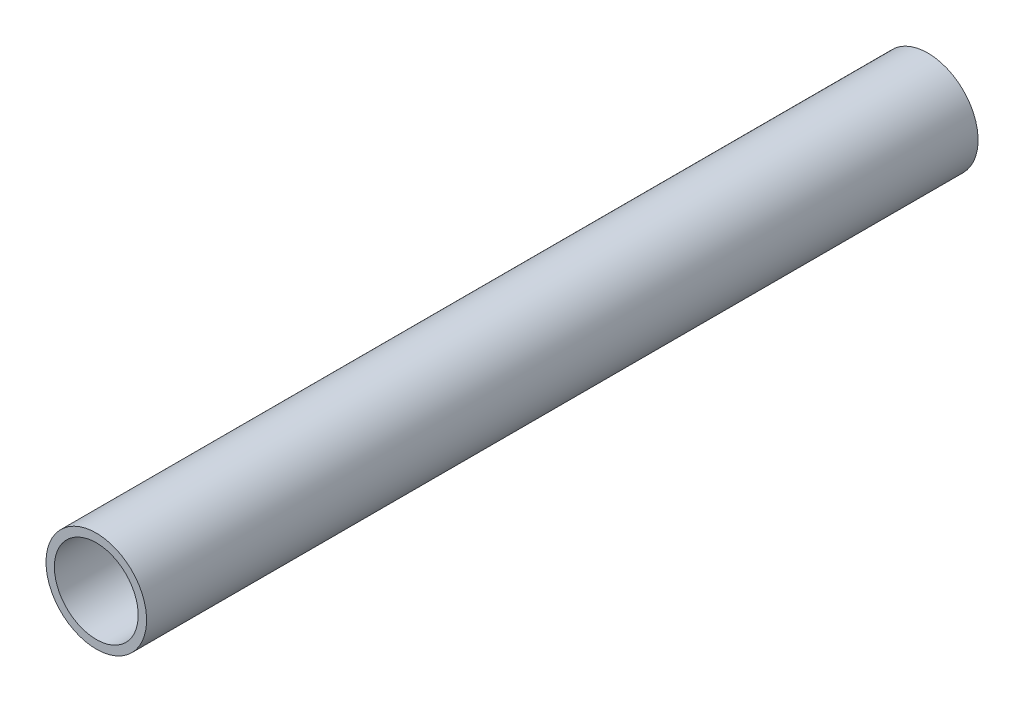
ISO-10303-21;
HEADER;
FILE_DESCRIPTION(('STEP AP214'),'2;1');
FILE_NAME('part.step','',(''),(''),'','','');
FILE_SCHEMA(('AUTOMOTIVE_DESIGN { 1 0 10303 214 1 1 1 1 }'));
ENDSEC;
DATA;
#1=APPLICATION_CONTEXT('core data for automotive mechanical design processes');
#2=APPLICATION_PROTOCOL_DEFINITION('international standard','automotive_design',2000,#1);
#3=PRODUCT_CONTEXT('',#1,'mechanical');
#4=PRODUCT('Part','Part','',(#3));
#5=PRODUCT_RELATED_PRODUCT_CATEGORY('part','',(#4));
#6=PRODUCT_DEFINITION_FORMATION('','',#4);
#7=PRODUCT_DEFINITION_CONTEXT('part definition',#1,'design');
#8=PRODUCT_DEFINITION('design','',#6,#7);
#9=PRODUCT_DEFINITION_SHAPE('','',#8);
#10=(LENGTH_UNIT() NAMED_UNIT(*) SI_UNIT(.MILLI.,.METRE.));
#11=(NAMED_UNIT(*) PLANE_ANGLE_UNIT() SI_UNIT($,.RADIAN.));
#12=(NAMED_UNIT(*) SI_UNIT($,.STERADIAN.) SOLID_ANGLE_UNIT());
#13=UNCERTAINTY_MEASURE_WITH_UNIT(LENGTH_MEASURE(1.E-05),#10,'distance_accuracy_value','');
#14=(GEOMETRIC_REPRESENTATION_CONTEXT(3) GLOBAL_UNCERTAINTY_ASSIGNED_CONTEXT((#13)) GLOBAL_UNIT_ASSIGNED_CONTEXT((#10,
#11,#12)) REPRESENTATION_CONTEXT('',''));
#15=CARTESIAN_POINT('',(0.,0.,0.));
#16=DIRECTION('',(0.,0.,1.));
#17=DIRECTION('',(1.,0.,0.));
#18=AXIS2_PLACEMENT_3D('',#15,#16,#17);
#19=CARTESIAN_POINT('',(0.,0.,0.));
#20=DIRECTION('',(0.,0.,1.));
#21=DIRECTION('',(1.,0.,0.));
#22=AXIS2_PLACEMENT_3D('',#19,#20,#21);
#23=PLANE('',#22);
#24=CARTESIAN_POINT('',(0.,0.,0.));
#25=DIRECTION('',(0.,0.,-1.));
#26=DIRECTION('',(1.,0.,0.));
#27=AXIS2_PLACEMENT_3D('',#24,#25,#26);
#28=CIRCLE('',#27,12.5);
#29=CARTESIAN_POINT('',(-12.5,0.,0.));
#30=VERTEX_POINT('',#29);
#31=EDGE_CURVE('E57',#30,#30,#28,.T.);
#32=ORIENTED_EDGE('',*,*,#31,.F.);
#33=EDGE_LOOP('',(#32));
#34=FACE_BOUND('',#33,.T.);
#35=CARTESIAN_POINT('',(0.,0.,0.));
#36=DIRECTION('',(0.,0.,1.));
#37=DIRECTION('',(1.,0.,0.));
#38=AXIS2_PLACEMENT_3D('',#35,#36,#37);
#39=CIRCLE('',#38,15.);
#40=CARTESIAN_POINT('',(-15.,0.,0.));
#41=VERTEX_POINT('',#40);
#42=EDGE_CURVE('E11',#41,#41,#39,.T.);
#43=ORIENTED_EDGE('',*,*,#42,.F.);
#44=EDGE_LOOP('',(#43));
#45=FACE_BOUND('',#44,.T.);
#46=ADVANCED_FACE('F17',(#34,#45),#23,.F.);
#47=CARTESIAN_POINT('',(0.,0.,248.));
#48=DIRECTION('',(0.,0.,1.));
#49=DIRECTION('',(1.,0.,0.));
#50=AXIS2_PLACEMENT_3D('',#47,#48,#49);
#51=PLANE('',#50);
#52=CARTESIAN_POINT('',(0.,0.,248.));
#53=DIRECTION('',(0.,0.,-1.));
#54=DIRECTION('',(1.,0.,0.));
#55=AXIS2_PLACEMENT_3D('',#52,#53,#54);
#56=CIRCLE('',#55,12.5);
#57=CARTESIAN_POINT('',(-12.5,0.,248.));
#58=VERTEX_POINT('',#57);
#59=EDGE_CURVE('E55',#58,#58,#56,.T.);
#60=ORIENTED_EDGE('',*,*,#59,.T.);
#61=EDGE_LOOP('',(#60));
#62=FACE_BOUND('',#61,.T.);
#63=CARTESIAN_POINT('',(0.,0.,248.));
#64=DIRECTION('',(0.,0.,1.));
#65=DIRECTION('',(1.,0.,0.));
#66=AXIS2_PLACEMENT_3D('',#63,#64,#65);
#67=CIRCLE('',#66,15.);
#68=CARTESIAN_POINT('',(-15.,0.,248.));
#69=VERTEX_POINT('',#68);
#70=EDGE_CURVE('E71',#69,#69,#67,.T.);
#71=ORIENTED_EDGE('',*,*,#70,.T.);
#72=EDGE_LOOP('',(#71));
#73=FACE_BOUND('',#72,.T.);
#74=ADVANCED_FACE('F61',(#62,#73),#51,.T.);
#75=CARTESIAN_POINT('',(0.,0.,0.));
#76=DIRECTION('',(0.,0.,1.));
#77=DIRECTION('',(1.,0.,0.));
#78=AXIS2_PLACEMENT_3D('',#75,#76,#77);
#79=CYLINDRICAL_SURFACE('',#78,15.);
#80=ORIENTED_EDGE('',*,*,#70,.F.);
#81=DIRECTION('',(0.,0.,-1.));
#82=VECTOR('',#81,1.);
#83=CARTESIAN_POINT('',(-15.,0.,0.));
#84=LINE('',#83,#82);
#85=EDGE_CURVE('E25',#69,#41,#84,.T.);
#86=ORIENTED_EDGE('',*,*,#85,.T.);
#87=ORIENTED_EDGE('',*,*,#42,.T.);
#88=ORIENTED_EDGE('',*,*,#85,.F.);
#89=EDGE_LOOP('',(#80,#86,#87,#88));
#90=FACE_BOUND('',#89,.T.);
#91=ADVANCED_FACE('F76',(#90),#79,.T.);
#92=CARTESIAN_POINT('',(0.,0.,0.));
#93=DIRECTION('',(0.,0.,1.));
#94=DIRECTION('',(1.,0.,0.));
#95=AXIS2_PLACEMENT_3D('',#92,#93,#94);
#96=CYLINDRICAL_SURFACE('',#95,12.5);
#97=ORIENTED_EDGE('',*,*,#59,.F.);
#98=DIRECTION('',(0.,0.,-1.));
#99=VECTOR('',#98,1.);
#100=CARTESIAN_POINT('',(-12.5,0.,0.));
#101=LINE('',#100,#99);
#102=EDGE_CURVE('E52',#58,#30,#101,.T.);
#103=ORIENTED_EDGE('',*,*,#102,.T.);
#104=ORIENTED_EDGE('',*,*,#31,.T.);
#105=ORIENTED_EDGE('',*,*,#102,.F.);
#106=EDGE_LOOP('',(#97,#103,#104,#105));
#107=FACE_BOUND('',#106,.T.);
#108=ADVANCED_FACE('F54',(#107),#96,.F.);
#109=CLOSED_SHELL('',(#46,#74,#91,#108));
#110=MANIFOLD_SOLID_BREP('B1',#109);
#111=ADVANCED_BREP_SHAPE_REPRESENTATION('',(#18,#110),#14);
#112=SHAPE_DEFINITION_REPRESENTATION(#9,#111);
ENDSEC;
END-ISO-10303-21;
